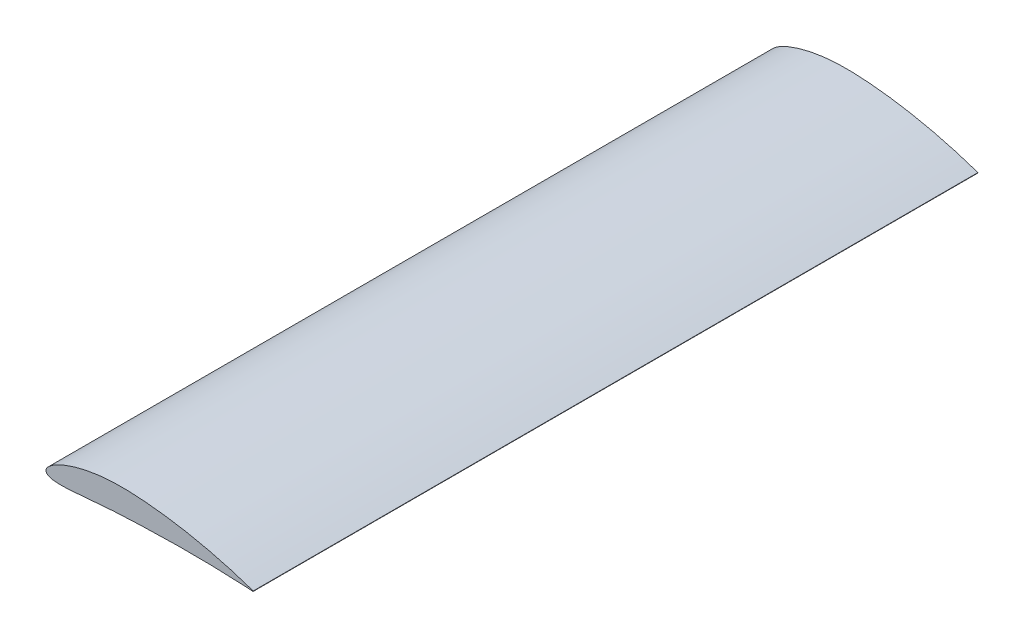
ISO-10303-21;
HEADER;
FILE_DESCRIPTION(('STEP AP214'),'2;1');
FILE_NAME('part.step','',(''),(''),'','','');
FILE_SCHEMA(('AUTOMOTIVE_DESIGN { 1 0 10303 214 1 1 1 1 }'));
ENDSEC;
DATA;
#1=APPLICATION_CONTEXT('core data for automotive mechanical design processes');
#2=APPLICATION_PROTOCOL_DEFINITION('international standard','automotive_design',2000,#1);
#3=PRODUCT_CONTEXT('',#1,'mechanical');
#4=PRODUCT('Part','Part','',(#3));
#5=PRODUCT_RELATED_PRODUCT_CATEGORY('part','',(#4));
#6=PRODUCT_DEFINITION_FORMATION('','',#4);
#7=PRODUCT_DEFINITION_CONTEXT('part definition',#1,'design');
#8=PRODUCT_DEFINITION('design','',#6,#7);
#9=PRODUCT_DEFINITION_SHAPE('','',#8);
#10=(LENGTH_UNIT() NAMED_UNIT(*) SI_UNIT(.MILLI.,.METRE.));
#11=(NAMED_UNIT(*) PLANE_ANGLE_UNIT() SI_UNIT($,.RADIAN.));
#12=(NAMED_UNIT(*) SI_UNIT($,.STERADIAN.) SOLID_ANGLE_UNIT());
#13=UNCERTAINTY_MEASURE_WITH_UNIT(LENGTH_MEASURE(1.E-05),#10,'distance_accuracy_value','');
#14=(GEOMETRIC_REPRESENTATION_CONTEXT(3) GLOBAL_UNCERTAINTY_ASSIGNED_CONTEXT((#13)) GLOBAL_UNIT_ASSIGNED_CONTEXT((#10,
#11,#12)) REPRESENTATION_CONTEXT('',''));
#15=CARTESIAN_POINT('',(0.,0.,0.));
#16=DIRECTION('',(0.,0.,1.));
#17=DIRECTION('',(1.,0.,0.));
#18=AXIS2_PLACEMENT_3D('',#15,#16,#17);
#19=CARTESIAN_POINT('',(2000.5,2.48,7000.));
#20=CARTESIAN_POINT('',(1998.71997346634,3.09325428208862,7000.));
#21=CARTESIAN_POINT('',(1991.62780973104,5.53664470222557,7000.));
#22=CARTESIAN_POINT('',(1975.75236303062,11.0154528536389,7000.));
#23=CARTESIAN_POINT('',(1949.4271046254,19.8549405305814,7000.));
#24=CARTESIAN_POINT('',(1912.92994978073,31.8892358372679,7000.));
#25=CARTESIAN_POINT('',(1866.57222042641,46.6246619502535,7000.));
#26=CARTESIAN_POINT('',(1810.78709743089,63.6017394808443,7000.));
#27=CARTESIAN_POINT('',(1746.12222920803,82.2883890018384,7000.));
#28=CARTESIAN_POINT('',(1673.19911885745,102.096502559632,7000.));
#29=CARTESIAN_POINT('',(1592.75247158902,122.428600551128,7000.));
#30=CARTESIAN_POINT('',(1505.59064233896,142.641818898273,7000.));
#31=CARTESIAN_POINT('',(1412.64614701571,162.228777768193,7000.));
#32=CARTESIAN_POINT('',(1314.88926933986,180.555210462007,7000.));
#33=CARTESIAN_POINT('',(1213.37426025761,197.082055501322,7000.));
#34=CARTESIAN_POINT('',(1109.21573174094,211.380152381997,7000.));
#35=CARTESIAN_POINT('',(1003.58401255394,222.990395917605,7000.));
#36=CARTESIAN_POINT('',(897.61232503641,231.544304972816,7000.));
#37=CARTESIAN_POINT('',(791.779253444584,237.161700337851,7000.));
#38=CARTESIAN_POINT('',(687.216363968917,237.822854544965,7000.));
#39=CARTESIAN_POINT('',(585.38496788642,232.713959485382,7000.));
#40=CARTESIAN_POINT('',(488.398041897167,222.345575122376,7000.));
#41=CARTESIAN_POINT('',(397.538593931862,207.329692992825,7000.));
#42=CARTESIAN_POINT('',(314.00232444231,188.321618169576,7000.));
#43=CARTESIAN_POINT('',(238.836293887697,166.24937406623,7000.));
#44=CARTESIAN_POINT('',(172.919112588367,142.1023130136,7000.));
#45=CARTESIAN_POINT('',(116.96007258221,116.857412228199,7000.));
#46=CARTESIAN_POINT('',(71.4890846939296,91.487443786784,7000.));
#47=CARTESIAN_POINT('',(36.7079994587927,66.8889325460571,7000.));
#48=CARTESIAN_POINT('',(12.8032430860759,43.5966499498465,7000.));
#49=CARTESIAN_POINT('',(-0.956904320393038,21.5374038383589,7000.));
#50=CARTESIAN_POINT('',(-2.20428830019669,-0.664454831617421,7000.));
#51=CARTESIAN_POINT('',(10.9565779864521,-18.4515566376858,7000.));
#52=CARTESIAN_POINT('',(34.0285432112235,-29.5896348297426,7000.));
#53=CARTESIAN_POINT('',(65.749435870981,-36.9021872304722,7000.));
#54=CARTESIAN_POINT('',(106.616900751524,-40.7350254897602,7000.));
#55=CARTESIAN_POINT('',(156.223683152552,-41.5023511327909,7000.));
#56=CARTESIAN_POINT('',(214.094919498778,-39.5265800413184,7000.));
#57=CARTESIAN_POINT('',(279.579292638063,-35.2949199487544,7000.));
#58=CARTESIAN_POINT('',(352.00431674935,-29.3079617986586,7000.));
#59=CARTESIAN_POINT('',(430.665724427835,-22.250096593326,7000.));
#60=CARTESIAN_POINT('',(514.854667714175,-14.7247426414869,7000.));
#61=CARTESIAN_POINT('',(603.841792184979,-7.38439255270194,7000.));
#62=CARTESIAN_POINT('',(696.888247231615,-0.911364665312287,7000.));
#63=CARTESIAN_POINT('',(793.963295632009,3.96638071268733,7000.));
#64=CARTESIAN_POINT('',(894.202668208769,7.41172623630428,7000.));
#65=CARTESIAN_POINT('',(996.556522685796,10.9636626918349,7000.));
#66=CARTESIAN_POINT('',(1099.24411272887,13.8010756228503,7000.));
#67=CARTESIAN_POINT('',(1201.11973840254,15.8557598044682,7000.));
#68=CARTESIAN_POINT('',(1301.09686184938,17.0081493161173,7000.));
#69=CARTESIAN_POINT('',(1398.074470322,17.2137481220841,7000.));
#70=CARTESIAN_POINT('',(1490.97157068829,16.5326068380281,7000.));
#71=CARTESIAN_POINT('',(1578.74096485776,15.1195872006718,7000.));
#72=CARTESIAN_POINT('',(1660.37031444209,13.0177679548331,7000.));
#73=CARTESIAN_POINT('',(1734.90317019637,10.5935462684374,7000.));
#74=CARTESIAN_POINT('',(1801.48776855778,7.8863169404082,7000.));
#75=CARTESIAN_POINT('',(1859.19439181528,5.30784575606375,7000.));
#76=CARTESIAN_POINT('',(1907.71398351328,2.5724583470709,7000.));
#77=CARTESIAN_POINT('',(1945.35275973841,1.24809470266517,7000.));
#78=CARTESIAN_POINT('',(1974.33921147882,-2.11680106087656,7000.));
#79=CARTESIAN_POINT('',(1988.70415210633,-0.0288737963276958,7000.));
#80=CARTESIAN_POINT('',(1999.75965227067,-4.09619567509498,7000.));
#81=CARTESIAN_POINT('',(1999.94311958962,-0.969400841213567,7000.));
#82=CARTESIAN_POINT('',(2000.,0.,7000.));
#83=B_SPLINE_CURVE_WITH_KNOTS('',3,(#19,#20,#21,#22,#23,#24,#25,#26,#27,#28,#29,#30,#31,#32,#33,
#34,#35,#36,#37,#38,#39,#40,#41,#42,#43,#44,#45,#46,#47,#48,#49,#50,#51,#52,#53,#54,#55,#56,#57,
#58,#59,#60,#61,#62,#63,#64,#65,#66,#67,#68,#69,#70,#71,#72,#73,#74,#75,#76,#77,#78,#79,#80,#81,
#82),.UNSPECIFIED.,.F.,.F.,(4,1,1,1,1,1,1,1,1,1,1,1,1,1,1,1,1,1,1,1,1,1,1,1,1,1,1,1,1,1,1,1,1,1,
1,1,1,1,1,1,1,1,1,1,1,1,1,1,1,1,1,1,1,1,1,1,1,1,1,1,1,4),(0.,0.00137157662502612,
0.00546477584250821,0.0122348018502247,0.0216019692657692,0.0334613445682541,0.0476712497544171,
0.0640813180473264,0.082496261138008,0.102719148689264,0.124527079157664,0.14767564836169,
0.171912572572513,0.196978379588112,0.222596912267761,0.248496766675201,0.274385100810321,
0.300041178316028,0.325689987882079,0.350525087532111,0.374279703233646,0.39671125377608,
0.41757673414408,0.436654005915542,0.45374438973928,0.468679993939526,0.481329415272233,
0.491630702034347,0.499615788540128,0.50554628117804,0.510184984462959,0.514824193684277,
0.520701508332397,0.528516039729706,0.538465751713385,0.55054260931231,0.564643256443601,
0.580638139182816,0.59834487637577,0.617584458372554,0.638174400803704,0.659922089978603,
0.682632113153432,0.706120665440723,0.730727382957721,0.755700243562022,0.780731768779878,
0.805564462972336,0.829932395841959,0.853570292180874,0.876213105152017,0.897609986535304,
0.917519393525195,0.935698347216139,0.951942678095032,0.966047158851578,0.977839939974046,
0.987174001699795,0.993931500880097,0.998018399437236,0.999385643972647,1.),.UNSPECIFIED.);
#84=DIRECTION('',(0.,0.,-1.));
#85=VECTOR('',#84,1.);
#86=SURFACE_OF_LINEAR_EXTRUSION('',#83,#85);
#87=CARTESIAN_POINT('',(2000.5,2.48,0.));
#88=CARTESIAN_POINT('',(1998.71997346634,3.09325428208862,0.));
#89=CARTESIAN_POINT('',(1991.62780973104,5.53664470222557,0.));
#90=CARTESIAN_POINT('',(1975.75236303062,11.0154528536389,0.));
#91=CARTESIAN_POINT('',(1949.4271046254,19.8549405305814,0.));
#92=CARTESIAN_POINT('',(1912.92994978073,31.8892358372679,0.));
#93=CARTESIAN_POINT('',(1866.57222042641,46.6246619502535,0.));
#94=CARTESIAN_POINT('',(1810.78709743089,63.6017394808443,0.));
#95=CARTESIAN_POINT('',(1746.12222920803,82.2883890018384,0.));
#96=CARTESIAN_POINT('',(1673.19911885745,102.096502559632,0.));
#97=CARTESIAN_POINT('',(1592.75247158902,122.428600551128,0.));
#98=CARTESIAN_POINT('',(1505.59064233896,142.641818898273,0.));
#99=CARTESIAN_POINT('',(1412.64614701571,162.228777768193,0.));
#100=CARTESIAN_POINT('',(1314.88926933986,180.555210462007,0.));
#101=CARTESIAN_POINT('',(1213.37426025761,197.082055501322,0.));
#102=CARTESIAN_POINT('',(1109.21573174094,211.380152381997,0.));
#103=CARTESIAN_POINT('',(1003.58401255394,222.990395917605,0.));
#104=CARTESIAN_POINT('',(897.61232503641,231.544304972816,0.));
#105=CARTESIAN_POINT('',(791.779253444584,237.161700337851,0.));
#106=CARTESIAN_POINT('',(687.216363968917,237.822854544965,0.));
#107=CARTESIAN_POINT('',(585.38496788642,232.713959485382,0.));
#108=CARTESIAN_POINT('',(488.398041897167,222.345575122376,0.));
#109=CARTESIAN_POINT('',(397.538593931862,207.329692992825,0.));
#110=CARTESIAN_POINT('',(314.00232444231,188.321618169576,0.));
#111=CARTESIAN_POINT('',(238.836293887697,166.24937406623,0.));
#112=CARTESIAN_POINT('',(172.919112588367,142.1023130136,0.));
#113=CARTESIAN_POINT('',(116.96007258221,116.857412228199,0.));
#114=CARTESIAN_POINT('',(71.4890846939296,91.487443786784,0.));
#115=CARTESIAN_POINT('',(36.7079994587927,66.8889325460571,0.));
#116=CARTESIAN_POINT('',(12.8032430860759,43.5966499498465,0.));
#117=CARTESIAN_POINT('',(-0.956904320393038,21.5374038383589,0.));
#118=CARTESIAN_POINT('',(-2.20428830019669,-0.664454831617421,0.));
#119=CARTESIAN_POINT('',(10.9565779864521,-18.4515566376858,0.));
#120=CARTESIAN_POINT('',(34.0285432112235,-29.5896348297426,0.));
#121=CARTESIAN_POINT('',(65.749435870981,-36.9021872304722,0.));
#122=CARTESIAN_POINT('',(106.616900751524,-40.7350254897602,0.));
#123=CARTESIAN_POINT('',(156.223683152552,-41.5023511327909,0.));
#124=CARTESIAN_POINT('',(214.094919498778,-39.5265800413184,0.));
#125=CARTESIAN_POINT('',(279.579292638063,-35.2949199487544,0.));
#126=CARTESIAN_POINT('',(352.00431674935,-29.3079617986586,0.));
#127=CARTESIAN_POINT('',(430.665724427835,-22.250096593326,0.));
#128=CARTESIAN_POINT('',(514.854667714175,-14.7247426414869,0.));
#129=CARTESIAN_POINT('',(603.841792184979,-7.38439255270194,0.));
#130=CARTESIAN_POINT('',(696.888247231615,-0.911364665312287,0.));
#131=CARTESIAN_POINT('',(793.963295632009,3.96638071268733,0.));
#132=CARTESIAN_POINT('',(894.202668208769,7.41172623630428,0.));
#133=CARTESIAN_POINT('',(996.556522685796,10.9636626918349,0.));
#134=CARTESIAN_POINT('',(1099.24411272887,13.8010756228503,0.));
#135=CARTESIAN_POINT('',(1201.11973840254,15.8557598044682,0.));
#136=CARTESIAN_POINT('',(1301.09686184938,17.0081493161173,0.));
#137=CARTESIAN_POINT('',(1398.074470322,17.2137481220841,0.));
#138=CARTESIAN_POINT('',(1490.97157068829,16.5326068380281,0.));
#139=CARTESIAN_POINT('',(1578.74096485776,15.1195872006718,0.));
#140=CARTESIAN_POINT('',(1660.37031444209,13.0177679548331,0.));
#141=CARTESIAN_POINT('',(1734.90317019637,10.5935462684374,0.));
#142=CARTESIAN_POINT('',(1801.48776855778,7.8863169404082,0.));
#143=CARTESIAN_POINT('',(1859.19439181528,5.30784575606375,0.));
#144=CARTESIAN_POINT('',(1907.71398351328,2.5724583470709,0.));
#145=CARTESIAN_POINT('',(1945.35275973841,1.24809470266517,0.));
#146=CARTESIAN_POINT('',(1974.33921147882,-2.11680106087656,0.));
#147=CARTESIAN_POINT('',(1988.70415210633,-0.0288737963276958,0.));
#148=CARTESIAN_POINT('',(1999.75965227067,-4.09619567509498,0.));
#149=CARTESIAN_POINT('',(1999.94311958962,-0.969400841213567,0.));
#150=CARTESIAN_POINT('',(2000.,0.,0.));
#151=B_SPLINE_CURVE_WITH_KNOTS('',3,(#87,#88,#89,#90,#91,#92,#93,#94,#95,#96,#97,#98,#99,#100,
#101,#102,#103,#104,#105,#106,#107,#108,#109,#110,#111,#112,#113,#114,#115,#116,#117,#118,#119,
#120,#121,#122,#123,#124,#125,#126,#127,#128,#129,#130,#131,#132,#133,#134,#135,#136,#137,#138,
#139,#140,#141,#142,#143,#144,#145,#146,#147,#148,#149,#150),.UNSPECIFIED.,.F.,.F.,(4,1,1,1,1,1,
1,1,1,1,1,1,1,1,1,1,1,1,1,1,1,1,1,1,1,1,1,1,1,1,1,1,1,1,1,1,1,1,1,1,1,1,1,1,1,1,1,1,1,1,1,1,1,1,
1,1,1,1,1,1,1,4),(0.,0.00137157662502612,0.00546477584250821,0.0122348018502247,
0.0216019692657692,0.0334613445682541,0.0476712497544171,0.0640813180473264,0.082496261138008,
0.102719148689264,0.124527079157664,0.14767564836169,0.171912572572513,0.196978379588112,
0.222596912267761,0.248496766675201,0.274385100810321,0.300041178316028,0.325689987882079,
0.350525087532111,0.374279703233646,0.39671125377608,0.41757673414408,0.436654005915542,
0.45374438973928,0.468679993939526,0.481329415272233,0.491630702034347,0.499615788540128,
0.50554628117804,0.510184984462959,0.514824193684277,0.520701508332397,0.528516039729706,
0.538465751713385,0.55054260931231,0.564643256443601,0.580638139182816,0.59834487637577,
0.617584458372554,0.638174400803704,0.659922089978603,0.682632113153432,0.706120665440723,
0.730727382957721,0.755700243562022,0.780731768779878,0.805564462972336,0.829932395841959,
0.853570292180874,0.876213105152017,0.897609986535304,0.917519393525195,0.935698347216139,
0.951942678095032,0.966047158851578,0.977839939974046,0.987174001699795,0.993931500880097,
0.998018399437236,0.999385643972647,1.),.UNSPECIFIED.);
#152=CARTESIAN_POINT('',(2000.5,2.48000000000003,0.));
#153=VERTEX_POINT('',#152);
#154=CARTESIAN_POINT('',(2000.,0.,0.));
#155=VERTEX_POINT('',#154);
#156=EDGE_CURVE('E73',#153,#155,#151,.T.);
#157=ORIENTED_EDGE('',*,*,#156,.T.);
#158=DIRECTION('',(0.,0.,-1.));
#159=VECTOR('',#158,1.);
#160=CARTESIAN_POINT('',(2000.,0.,7000.));
#161=LINE('',#160,#159);
#162=CARTESIAN_POINT('',(2000.,0.,7000.));
#163=VERTEX_POINT('',#162);
#164=EDGE_CURVE('E11',#163,#155,#161,.T.);
#165=ORIENTED_EDGE('',*,*,#164,.F.);
#166=CARTESIAN_POINT('',(2000.5,2.48,7000.));
#167=CARTESIAN_POINT('',(1998.71997346634,3.09325428208862,7000.));
#168=CARTESIAN_POINT('',(1991.62780973104,5.53664470222557,7000.));
#169=CARTESIAN_POINT('',(1975.75236303062,11.0154528536389,7000.));
#170=CARTESIAN_POINT('',(1949.4271046254,19.8549405305814,7000.));
#171=CARTESIAN_POINT('',(1912.92994978073,31.8892358372679,7000.));
#172=CARTESIAN_POINT('',(1866.57222042641,46.6246619502535,7000.));
#173=CARTESIAN_POINT('',(1810.78709743089,63.6017394808443,7000.));
#174=CARTESIAN_POINT('',(1746.12222920803,82.2883890018384,7000.));
#175=CARTESIAN_POINT('',(1673.19911885745,102.096502559632,7000.));
#176=CARTESIAN_POINT('',(1592.75247158902,122.428600551128,7000.));
#177=CARTESIAN_POINT('',(1505.59064233896,142.641818898273,7000.));
#178=CARTESIAN_POINT('',(1412.64614701571,162.228777768193,7000.));
#179=CARTESIAN_POINT('',(1314.88926933986,180.555210462007,7000.));
#180=CARTESIAN_POINT('',(1213.37426025761,197.082055501322,7000.));
#181=CARTESIAN_POINT('',(1109.21573174094,211.380152381997,7000.));
#182=CARTESIAN_POINT('',(1003.58401255394,222.990395917605,7000.));
#183=CARTESIAN_POINT('',(897.61232503641,231.544304972816,7000.));
#184=CARTESIAN_POINT('',(791.779253444584,237.161700337851,7000.));
#185=CARTESIAN_POINT('',(687.216363968917,237.822854544965,7000.));
#186=CARTESIAN_POINT('',(585.38496788642,232.713959485382,7000.));
#187=CARTESIAN_POINT('',(488.398041897167,222.345575122376,7000.));
#188=CARTESIAN_POINT('',(397.538593931862,207.329692992825,7000.));
#189=CARTESIAN_POINT('',(314.00232444231,188.321618169576,7000.));
#190=CARTESIAN_POINT('',(238.836293887697,166.24937406623,7000.));
#191=CARTESIAN_POINT('',(172.919112588367,142.1023130136,7000.));
#192=CARTESIAN_POINT('',(116.96007258221,116.857412228199,7000.));
#193=CARTESIAN_POINT('',(71.4890846939296,91.487443786784,7000.));
#194=CARTESIAN_POINT('',(36.7079994587927,66.8889325460571,7000.));
#195=CARTESIAN_POINT('',(12.8032430860759,43.5966499498465,7000.));
#196=CARTESIAN_POINT('',(-0.956904320393038,21.5374038383589,7000.));
#197=CARTESIAN_POINT('',(-2.20428830019669,-0.664454831617421,7000.));
#198=CARTESIAN_POINT('',(10.9565779864521,-18.4515566376858,7000.));
#199=CARTESIAN_POINT('',(34.0285432112235,-29.5896348297426,7000.));
#200=CARTESIAN_POINT('',(65.749435870981,-36.9021872304722,7000.));
#201=CARTESIAN_POINT('',(106.616900751524,-40.7350254897602,7000.));
#202=CARTESIAN_POINT('',(156.223683152552,-41.5023511327909,7000.));
#203=CARTESIAN_POINT('',(214.094919498778,-39.5265800413184,7000.));
#204=CARTESIAN_POINT('',(279.579292638063,-35.2949199487544,7000.));
#205=CARTESIAN_POINT('',(352.00431674935,-29.3079617986586,7000.));
#206=CARTESIAN_POINT('',(430.665724427835,-22.250096593326,7000.));
#207=CARTESIAN_POINT('',(514.854667714175,-14.7247426414869,7000.));
#208=CARTESIAN_POINT('',(603.841792184979,-7.38439255270194,7000.));
#209=CARTESIAN_POINT('',(696.888247231615,-0.911364665312287,7000.));
#210=CARTESIAN_POINT('',(793.963295632009,3.96638071268733,7000.));
#211=CARTESIAN_POINT('',(894.202668208769,7.41172623630428,7000.));
#212=CARTESIAN_POINT('',(996.556522685796,10.9636626918349,7000.));
#213=CARTESIAN_POINT('',(1099.24411272887,13.8010756228503,7000.));
#214=CARTESIAN_POINT('',(1201.11973840254,15.8557598044682,7000.));
#215=CARTESIAN_POINT('',(1301.09686184938,17.0081493161173,7000.));
#216=CARTESIAN_POINT('',(1398.074470322,17.2137481220841,7000.));
#217=CARTESIAN_POINT('',(1490.97157068829,16.5326068380281,7000.));
#218=CARTESIAN_POINT('',(1578.74096485776,15.1195872006718,7000.));
#219=CARTESIAN_POINT('',(1660.37031444209,13.0177679548331,7000.));
#220=CARTESIAN_POINT('',(1734.90317019637,10.5935462684374,7000.));
#221=CARTESIAN_POINT('',(1801.48776855778,7.8863169404082,7000.));
#222=CARTESIAN_POINT('',(1859.19439181528,5.30784575606375,7000.));
#223=CARTESIAN_POINT('',(1907.71398351328,2.5724583470709,7000.));
#224=CARTESIAN_POINT('',(1945.35275973841,1.24809470266517,7000.));
#225=CARTESIAN_POINT('',(1974.33921147882,-2.11680106087656,7000.));
#226=CARTESIAN_POINT('',(1988.70415210633,-0.0288737963276958,7000.));
#227=CARTESIAN_POINT('',(1999.75965227067,-4.09619567509498,7000.));
#228=CARTESIAN_POINT('',(1999.94311958962,-0.969400841213567,7000.));
#229=CARTESIAN_POINT('',(2000.,0.,7000.));
#230=B_SPLINE_CURVE_WITH_KNOTS('',3,(#166,#167,#168,#169,#170,#171,#172,#173,#174,#175,#176,
#177,#178,#179,#180,#181,#182,#183,#184,#185,#186,#187,#188,#189,#190,#191,#192,#193,#194,#195,
#196,#197,#198,#199,#200,#201,#202,#203,#204,#205,#206,#207,#208,#209,#210,#211,#212,#213,#214,
#215,#216,#217,#218,#219,#220,#221,#222,#223,#224,#225,#226,#227,#228,#229),.UNSPECIFIED.,.F.,
.F.,(4,1,1,1,1,1,1,1,1,1,1,1,1,1,1,1,1,1,1,1,1,1,1,1,1,1,1,1,1,1,1,1,1,1,1,1,1,1,1,1,1,1,1,1,1,
1,1,1,1,1,1,1,1,1,1,1,1,1,1,1,1,4),(0.,0.00137157662502612,0.00546477584250821,
0.0122348018502247,0.0216019692657692,0.0334613445682541,0.0476712497544171,0.0640813180473264,
0.082496261138008,0.102719148689264,0.124527079157664,0.14767564836169,0.171912572572513,
0.196978379588112,0.222596912267761,0.248496766675201,0.274385100810321,0.300041178316028,
0.325689987882079,0.350525087532111,0.374279703233646,0.39671125377608,0.41757673414408,
0.436654005915542,0.45374438973928,0.468679993939526,0.481329415272233,0.491630702034347,
0.499615788540128,0.50554628117804,0.510184984462959,0.514824193684277,0.520701508332397,
0.528516039729706,0.538465751713385,0.55054260931231,0.564643256443601,0.580638139182816,
0.59834487637577,0.617584458372554,0.638174400803704,0.659922089978603,0.682632113153432,
0.706120665440723,0.730727382957721,0.755700243562022,0.780731768779878,0.805564462972336,
0.829932395841959,0.853570292180874,0.876213105152017,0.897609986535304,0.917519393525195,
0.935698347216139,0.951942678095032,0.966047158851578,0.977839939974046,0.987174001699795,
0.993931500880097,0.998018399437236,0.999385643972647,1.),.UNSPECIFIED.);
#231=CARTESIAN_POINT('',(2000.5,2.48000000000003,7000.));
#232=VERTEX_POINT('',#231);
#233=EDGE_CURVE('E62',#232,#163,#230,.T.);
#234=ORIENTED_EDGE('',*,*,#233,.F.);
#235=DIRECTION('',(0.,0.,-1.));
#236=VECTOR('',#235,1.);
#237=CARTESIAN_POINT('',(2000.5,2.48000000000003,7000.));
#238=LINE('',#237,#236);
#239=EDGE_CURVE('E48',#232,#153,#238,.T.);
#240=ORIENTED_EDGE('',*,*,#239,.T.);
#241=EDGE_LOOP('',(#157,#165,#234,#240));
#242=FACE_BOUND('',#241,.T.);
#243=ADVANCED_FACE('F37',(#242),#86,.F.);
#244=CARTESIAN_POINT('',(2000.08430465644,1.2734063192655,7000.));
#245=DIRECTION('',(0.,-3.47979411165152E-13,-1.));
#246=DIRECTION('',(0.,1.,-3.47979411165152E-13));
#247=AXIS2_PLACEMENT_3D('',#244,#245,#246);
#248=CYLINDRICAL_SURFACE('',#247,1.27619392297695);
#249=CARTESIAN_POINT('',(2000.08430465644,1.27340631926561,0.));
#250=DIRECTION('',(0.,0.,-1.));
#251=DIRECTION('',(-1.,0.,0.));
#252=AXIS2_PLACEMENT_3D('',#249,#250,#251);
#253=CIRCLE('',#252,1.27619392297695);
#254=EDGE_CURVE('E69',#153,#155,#253,.T.);
#255=ORIENTED_EDGE('',*,*,#254,.F.);
#256=ORIENTED_EDGE('',*,*,#239,.F.);
#257=CARTESIAN_POINT('',(2000.08430465644,1.27340631926561,7000.));
#258=DIRECTION('',(-4.39180179402394E-13,0.,-1.));
#259=DIRECTION('',(-1.,0.,4.39180179402394E-13));
#260=AXIS2_PLACEMENT_3D('',#257,#258,#259);
#261=CIRCLE('',#260,1.27619392297695);
#262=EDGE_CURVE('E70',#232,#163,#261,.T.);
#263=ORIENTED_EDGE('',*,*,#262,.T.);
#264=ORIENTED_EDGE('',*,*,#164,.T.);
#265=EDGE_LOOP('',(#255,#256,#263,#264));
#266=FACE_BOUND('',#265,.T.);
#267=ADVANCED_FACE('F67',(#266),#248,.T.);
#268=CARTESIAN_POINT('',(10.9328351004432,39.3138621779294,7000.));
#269=DIRECTION('',(0.,0.,1.));
#270=DIRECTION('',(1.,0.,0.));
#271=AXIS2_PLACEMENT_3D('',#268,#269,#270);
#272=PLANE('',#271);
#273=ORIENTED_EDGE('',*,*,#233,.T.);
#274=ORIENTED_EDGE('',*,*,#262,.F.);
#275=EDGE_LOOP('',(#273,#274));
#276=FACE_BOUND('',#275,.T.);
#277=ADVANCED_FACE('F90',(#276),#272,.T.);
#278=CARTESIAN_POINT('',(10.9328351004432,39.3138621779294,0.));
#279=DIRECTION('',(0.,0.,1.));
#280=DIRECTION('',(1.,0.,0.));
#281=AXIS2_PLACEMENT_3D('',#278,#279,#280);
#282=PLANE('',#281);
#283=ORIENTED_EDGE('',*,*,#156,.F.);
#284=ORIENTED_EDGE('',*,*,#254,.T.);
#285=EDGE_LOOP('',(#283,#284));
#286=FACE_BOUND('',#285,.T.);
#287=ADVANCED_FACE('F39',(#286),#282,.F.);
#288=CLOSED_SHELL('',(#243,#267,#277,#287));
#289=MANIFOLD_SOLID_BREP('B2',#288);
#290=ADVANCED_BREP_SHAPE_REPRESENTATION('',(#18,#289),#14);
#291=SHAPE_DEFINITION_REPRESENTATION(#9,#290);
ENDSEC;
END-ISO-10303-21;
